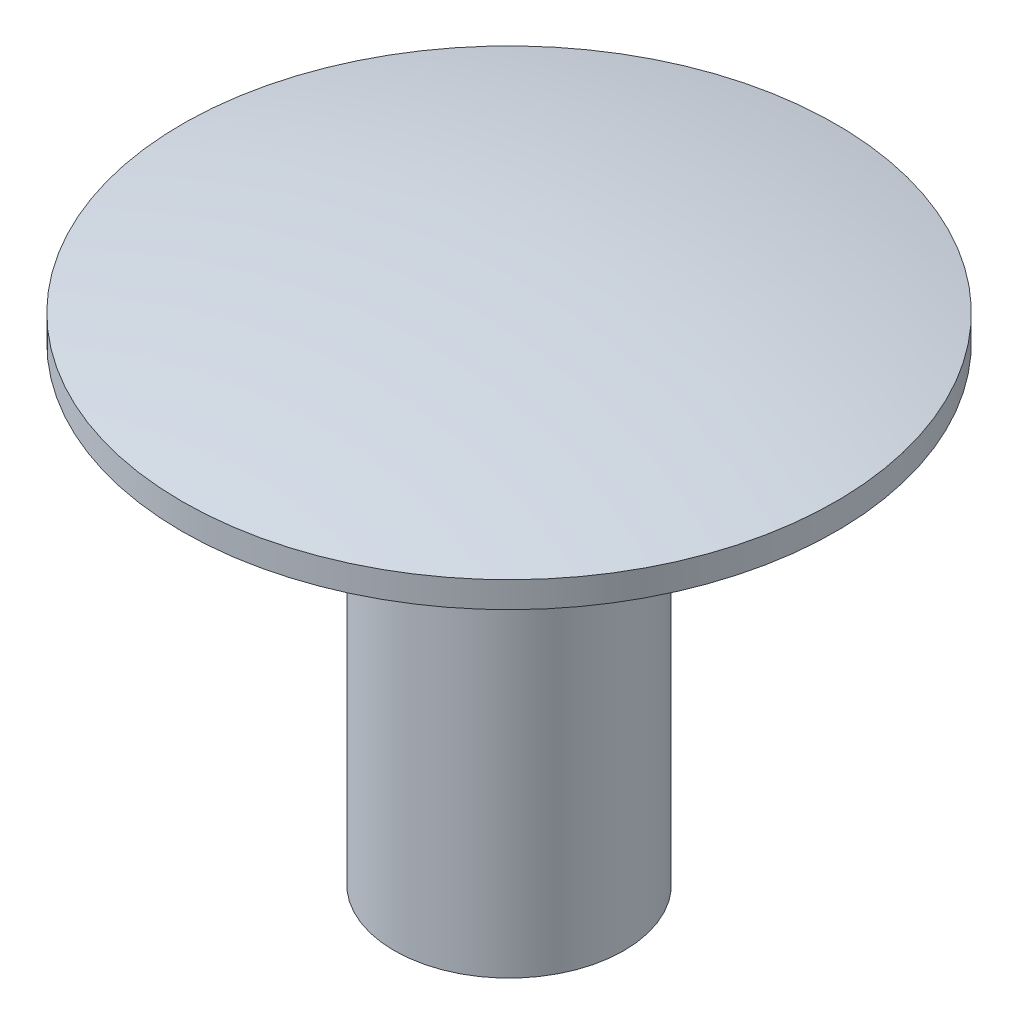
ISO-10303-21;
HEADER;
FILE_DESCRIPTION(('STEP AP214'),'2;1');
FILE_NAME('part.step','',(''),(''),'','','');
FILE_SCHEMA(('AUTOMOTIVE_DESIGN { 1 0 10303 214 1 1 1 1 }'));
ENDSEC;
DATA;
#1=APPLICATION_CONTEXT('core data for automotive mechanical design processes');
#2=APPLICATION_PROTOCOL_DEFINITION('international standard','automotive_design',2000,#1);
#3=PRODUCT_CONTEXT('',#1,'mechanical');
#4=PRODUCT('Part','Part','',(#3));
#5=PRODUCT_RELATED_PRODUCT_CATEGORY('part','',(#4));
#6=PRODUCT_DEFINITION_FORMATION('','',#4);
#7=PRODUCT_DEFINITION_CONTEXT('part definition',#1,'design');
#8=PRODUCT_DEFINITION('design','',#6,#7);
#9=PRODUCT_DEFINITION_SHAPE('','',#8);
#10=(LENGTH_UNIT() NAMED_UNIT(*) SI_UNIT(.MILLI.,.METRE.));
#11=(NAMED_UNIT(*) PLANE_ANGLE_UNIT() SI_UNIT($,.RADIAN.));
#12=(NAMED_UNIT(*) SI_UNIT($,.STERADIAN.) SOLID_ANGLE_UNIT());
#13=UNCERTAINTY_MEASURE_WITH_UNIT(LENGTH_MEASURE(1.E-05),#10,'distance_accuracy_value','');
#14=(GEOMETRIC_REPRESENTATION_CONTEXT(3) GLOBAL_UNCERTAINTY_ASSIGNED_CONTEXT((#13)) GLOBAL_UNIT_ASSIGNED_CONTEXT((#10,
#11,#12)) REPRESENTATION_CONTEXT('',''));
#15=CARTESIAN_POINT('',(0.,0.,0.));
#16=DIRECTION('',(0.,0.,1.));
#17=DIRECTION('',(1.,0.,0.));
#18=AXIS2_PLACEMENT_3D('',#15,#16,#17);
#19=CARTESIAN_POINT('',(16.8646618183738,18.4356462337195,0.));
#20=DIRECTION('',(0.,1.,0.));
#21=DIRECTION('',(0.,0.,1.));
#22=AXIS2_PLACEMENT_3D('',#19,#20,#21);
#23=PLANE('',#22);
#24=CARTESIAN_POINT('',(16.8646618183738,18.4356462337195,0.));
#25=DIRECTION('',(0.,-1.,0.));
#26=DIRECTION('',(0.,0.,-1.));
#27=AXIS2_PLACEMENT_3D('',#24,#25,#26);
#28=CIRCLE('',#27,0.777324110163557);
#29=CARTESIAN_POINT('',(16.8646618183738,18.4356462337195,-0.777324110163557));
#30=VERTEX_POINT('',#29);
#31=EDGE_CURVE('E18',#30,#30,#28,.F.);
#32=ORIENTED_EDGE('',*,*,#31,.F.);
#33=EDGE_LOOP('',(#32));
#34=FACE_BOUND('',#33,.T.);
#35=ADVANCED_FACE('F15',(#34),#23,.F.);
#36=CARTESIAN_POINT('',(16.8646618183738,21.6106462337195,0.));
#37=DIRECTION('',(0.,-1.,0.));
#38=DIRECTION('',(0.,0.,-1.));
#39=AXIS2_PLACEMENT_3D('',#36,#37,#38);
#40=CYLINDRICAL_SURFACE('',#39,0.777324110163557);
#41=CARTESIAN_POINT('',(16.8646618183738,21.6106462337195,0.));
#42=DIRECTION('',(0.,-1.,0.));
#43=DIRECTION('',(0.,0.,-1.));
#44=AXIS2_PLACEMENT_3D('',#41,#42,#43);
#45=CIRCLE('',#44,0.777324110163557);
#46=CARTESIAN_POINT('',(16.8646618183738,21.6106462337195,-0.777324110163557));
#47=VERTEX_POINT('',#46);
#48=EDGE_CURVE('E27',#47,#47,#45,.F.);
#49=ORIENTED_EDGE('',*,*,#48,.F.);
#50=EDGE_LOOP('',(#49));
#51=FACE_BOUND('',#50,.T.);
#52=ORIENTED_EDGE('',*,*,#31,.T.);
#53=EDGE_LOOP('',(#52));
#54=FACE_BOUND('',#53,.T.);
#55=ADVANCED_FACE('F37',(#51,#54),#40,.T.);
#56=CARTESIAN_POINT('',(15.7582968296001,21.6106462337195,0.));
#57=DIRECTION('',(0.,-1.,0.));
#58=DIRECTION('',(0.,0.,-1.));
#59=AXIS2_PLACEMENT_3D('',#56,#57,#58);
#60=PLANE('',#59);
#61=ORIENTED_EDGE('',*,*,#48,.T.);
#62=EDGE_LOOP('',(#61));
#63=FACE_BOUND('',#62,.T.);
#64=CARTESIAN_POINT('',(16.8646618183738,21.6106462337195,0.));
#65=DIRECTION('',(0.,1.,0.));
#66=DIRECTION('',(0.,0.,1.));
#67=AXIS2_PLACEMENT_3D('',#64,#65,#66);
#68=CIRCLE('',#67,2.21272997754728);
#69=CARTESIAN_POINT('',(16.8646618183738,21.6106462337195,2.21272997754728));
#70=VERTEX_POINT('',#69);
#71=EDGE_CURVE('E22',#70,#70,#68,.T.);
#72=ORIENTED_EDGE('',*,*,#71,.F.);
#73=EDGE_LOOP('',(#72));
#74=FACE_BOUND('',#73,.T.);
#75=ADVANCED_FACE('F44',(#63,#74),#60,.T.);
#76=CARTESIAN_POINT('',(16.8646618183738,21.6984974707604,0.));
#77=DIRECTION('',(0.,1.,0.));
#78=DIRECTION('',(0.,0.,1.));
#79=AXIS2_PLACEMENT_3D('',#76,#77,#78);
#80=CYLINDRICAL_SURFACE('',#79,2.21272997754728);
#81=ORIENTED_EDGE('',*,*,#71,.T.);
#82=EDGE_LOOP('',(#81));
#83=FACE_BOUND('',#82,.T.);
#84=CARTESIAN_POINT('',(16.8646618183738,21.7863487078013,0.));
#85=DIRECTION('',(0.,1.,0.));
#86=DIRECTION('',(0.,0.,1.));
#87=AXIS2_PLACEMENT_3D('',#84,#85,#86);
#88=CIRCLE('',#87,2.21272997754728);
#89=CARTESIAN_POINT('',(16.8646618183738,21.7863487078013,2.21272997754728));
#90=VERTEX_POINT('',#89);
#91=EDGE_CURVE('E10',#90,#90,#88,.T.);
#92=ORIENTED_EDGE('',*,*,#91,.F.);
#93=EDGE_LOOP('',(#92));
#94=FACE_BOUND('',#93,.T.);
#95=ADVANCED_FACE('F48',(#83,#94),#80,.T.);
#96=CARTESIAN_POINT('',(16.8646618183738,12.2634284466754,0.));
#97=DIRECTION('',(1.,0.,0.));
#98=DIRECTION('',(0.,1.,0.));
#99=AXIS2_PLACEMENT_3D('',#96,#97,#98);
#100=SPHERICAL_SURFACE('',#99,9.77661415078342);
#101=ORIENTED_EDGE('',*,*,#91,.T.);
#102=EDGE_LOOP('',(#101));
#103=FACE_BOUND('',#102,.T.);
#104=ADVANCED_FACE('F46',(#103),#100,.T.);
#105=CLOSED_SHELL('',(#35,#55,#75,#95,#104));
#106=MANIFOLD_SOLID_BREP('B1',#105);
#107=ADVANCED_BREP_SHAPE_REPRESENTATION('',(#18,#106),#14);
#108=SHAPE_DEFINITION_REPRESENTATION(#9,#107);
ENDSEC;
END-ISO-10303-21;
